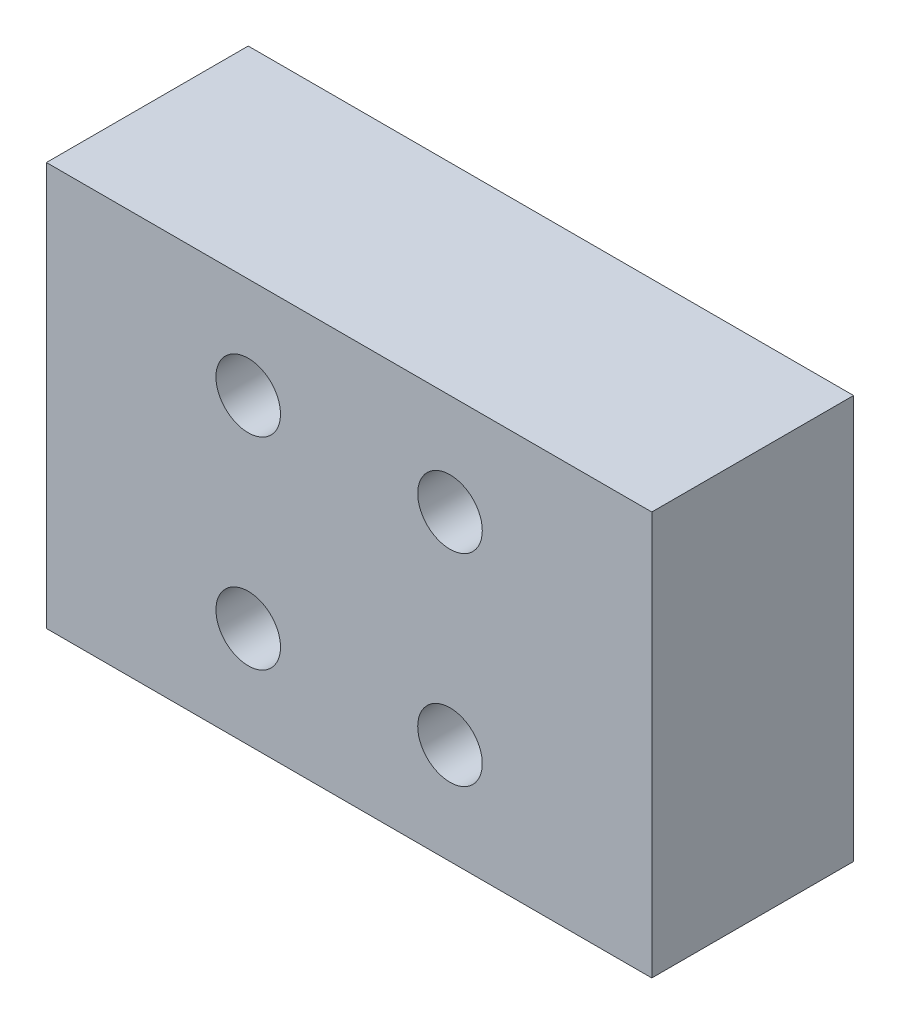
ISO-10303-21;
HEADER;
FILE_DESCRIPTION(('STEP AP214'),'2;1');
FILE_NAME('part.step','',(''),(''),'','','');
FILE_SCHEMA(('AUTOMOTIVE_DESIGN { 1 0 10303 214 1 1 1 1 }'));
ENDSEC;
DATA;
#1=APPLICATION_CONTEXT('core data for automotive mechanical design processes');
#2=APPLICATION_PROTOCOL_DEFINITION('international standard','automotive_design',2000,#1);
#3=PRODUCT_CONTEXT('',#1,'mechanical');
#4=PRODUCT('Part','Part','',(#3));
#5=PRODUCT_RELATED_PRODUCT_CATEGORY('part','',(#4));
#6=PRODUCT_DEFINITION_FORMATION('','',#4);
#7=PRODUCT_DEFINITION_CONTEXT('part definition',#1,'design');
#8=PRODUCT_DEFINITION('design','',#6,#7);
#9=PRODUCT_DEFINITION_SHAPE('','',#8);
#10=(LENGTH_UNIT() NAMED_UNIT(*) SI_UNIT(.MILLI.,.METRE.));
#11=(NAMED_UNIT(*) PLANE_ANGLE_UNIT() SI_UNIT($,.RADIAN.));
#12=(NAMED_UNIT(*) SI_UNIT($,.STERADIAN.) SOLID_ANGLE_UNIT());
#13=UNCERTAINTY_MEASURE_WITH_UNIT(LENGTH_MEASURE(1.E-05),#10,'distance_accuracy_value','');
#14=(GEOMETRIC_REPRESENTATION_CONTEXT(3) GLOBAL_UNCERTAINTY_ASSIGNED_CONTEXT((#13)) GLOBAL_UNIT_ASSIGNED_CONTEXT((#10,
#11,#12)) REPRESENTATION_CONTEXT('',''));
#15=CARTESIAN_POINT('',(0.,0.,0.));
#16=DIRECTION('',(0.,0.,1.));
#17=DIRECTION('',(1.,0.,0.));
#18=AXIS2_PLACEMENT_3D('',#15,#16,#17);
#19=CARTESIAN_POINT('',(0.,0.,10.));
#20=DIRECTION('',(1.,0.,0.));
#21=DIRECTION('',(0.,1.,0.));
#22=AXIS2_PLACEMENT_3D('',#19,#20,#21);
#23=PLANE('',#22);
#24=DIRECTION('',(0.,-1.,0.));
#25=VECTOR('',#24,1.);
#26=CARTESIAN_POINT('',(0.,0.,0.));
#27=LINE('',#26,#25);
#28=CARTESIAN_POINT('',(0.,0.,0.));
#29=VERTEX_POINT('',#28);
#30=CARTESIAN_POINT('',(0.,-20.,0.));
#31=VERTEX_POINT('',#30);
#32=EDGE_CURVE('E111',#29,#31,#27,.T.);
#33=ORIENTED_EDGE('',*,*,#32,.T.);
#34=DIRECTION('',(0.,0.,-1.));
#35=VECTOR('',#34,1.);
#36=CARTESIAN_POINT('',(0.,-20.,10.));
#37=LINE('',#36,#35);
#38=CARTESIAN_POINT('',(0.,-20.,10.));
#39=VERTEX_POINT('',#38);
#40=EDGE_CURVE('E11',#39,#31,#37,.T.);
#41=ORIENTED_EDGE('',*,*,#40,.F.);
#42=DIRECTION('',(0.,-1.,0.));
#43=VECTOR('',#42,1.);
#44=CARTESIAN_POINT('',(0.,0.,10.));
#45=LINE('',#44,#43);
#46=CARTESIAN_POINT('',(0.,0.,10.));
#47=VERTEX_POINT('',#46);
#48=EDGE_CURVE('E95',#47,#39,#45,.T.);
#49=ORIENTED_EDGE('',*,*,#48,.F.);
#50=DIRECTION('',(0.,0.,-1.));
#51=VECTOR('',#50,1.);
#52=CARTESIAN_POINT('',(0.,0.,10.));
#53=LINE('',#52,#51);
#54=EDGE_CURVE('E107',#47,#29,#53,.T.);
#55=ORIENTED_EDGE('',*,*,#54,.T.);
#56=EDGE_LOOP('',(#33,#41,#49,#55));
#57=FACE_BOUND('',#56,.T.);
#58=ADVANCED_FACE('F43',(#57),#23,.F.);
#59=CARTESIAN_POINT('',(0.,-20.,10.));
#60=DIRECTION('',(0.,1.,0.));
#61=DIRECTION('',(0.,0.,1.));
#62=AXIS2_PLACEMENT_3D('',#59,#60,#61);
#63=PLANE('',#62);
#64=DIRECTION('',(1.,0.,0.));
#65=VECTOR('',#64,1.);
#66=CARTESIAN_POINT('',(0.,-20.,0.));
#67=LINE('',#66,#65);
#68=CARTESIAN_POINT('',(30.,-20.,0.));
#69=VERTEX_POINT('',#68);
#70=EDGE_CURVE('E100',#31,#69,#67,.T.);
#71=ORIENTED_EDGE('',*,*,#70,.T.);
#72=DIRECTION('',(0.,0.,-1.));
#73=VECTOR('',#72,1.);
#74=CARTESIAN_POINT('',(30.,-20.,10.));
#75=LINE('',#74,#73);
#76=CARTESIAN_POINT('',(30.,-20.,10.));
#77=VERTEX_POINT('',#76);
#78=EDGE_CURVE('E52',#77,#69,#75,.T.);
#79=ORIENTED_EDGE('',*,*,#78,.F.);
#80=DIRECTION('',(1.,0.,0.));
#81=VECTOR('',#80,1.);
#82=CARTESIAN_POINT('',(0.,-20.,10.));
#83=LINE('',#82,#81);
#84=EDGE_CURVE('E90',#39,#77,#83,.T.);
#85=ORIENTED_EDGE('',*,*,#84,.F.);
#86=ORIENTED_EDGE('',*,*,#40,.T.);
#87=EDGE_LOOP('',(#71,#79,#85,#86));
#88=FACE_BOUND('',#87,.T.);
#89=ADVANCED_FACE('F99',(#88),#63,.F.);
#90=CARTESIAN_POINT('',(30.,0.,10.));
#91=DIRECTION('',(-1.,0.,0.));
#92=DIRECTION('',(0.,-1.,0.));
#93=AXIS2_PLACEMENT_3D('',#90,#91,#92);
#94=PLANE('',#93);
#95=DIRECTION('',(0.,1.,0.));
#96=VECTOR('',#95,1.);
#97=CARTESIAN_POINT('',(30.,0.,0.));
#98=LINE('',#97,#96);
#99=CARTESIAN_POINT('',(30.,0.,0.));
#100=VERTEX_POINT('',#99);
#101=EDGE_CURVE('E77',#69,#100,#98,.T.);
#102=ORIENTED_EDGE('',*,*,#101,.T.);
#103=DIRECTION('',(0.,0.,-1.));
#104=VECTOR('',#103,1.);
#105=CARTESIAN_POINT('',(30.,0.,10.));
#106=LINE('',#105,#104);
#107=CARTESIAN_POINT('',(30.,0.,10.));
#108=VERTEX_POINT('',#107);
#109=EDGE_CURVE('E102',#108,#100,#106,.T.);
#110=ORIENTED_EDGE('',*,*,#109,.F.);
#111=DIRECTION('',(0.,1.,0.));
#112=VECTOR('',#111,1.);
#113=CARTESIAN_POINT('',(30.,0.,10.));
#114=LINE('',#113,#112);
#115=EDGE_CURVE('E93',#77,#108,#114,.T.);
#116=ORIENTED_EDGE('',*,*,#115,.F.);
#117=ORIENTED_EDGE('',*,*,#78,.T.);
#118=EDGE_LOOP('',(#102,#110,#116,#117));
#119=FACE_BOUND('',#118,.T.);
#120=ADVANCED_FACE('F103',(#119),#94,.F.);
#121=CARTESIAN_POINT('',(0.,0.,10.));
#122=DIRECTION('',(0.,-1.,0.));
#123=DIRECTION('',(0.,0.,-1.));
#124=AXIS2_PLACEMENT_3D('',#121,#122,#123);
#125=PLANE('',#124);
#126=DIRECTION('',(-1.,0.,0.));
#127=VECTOR('',#126,1.);
#128=CARTESIAN_POINT('',(0.,0.,0.));
#129=LINE('',#128,#127);
#130=EDGE_CURVE('E83',#100,#29,#129,.T.);
#131=ORIENTED_EDGE('',*,*,#130,.T.);
#132=ORIENTED_EDGE('',*,*,#54,.F.);
#133=DIRECTION('',(-1.,0.,0.));
#134=VECTOR('',#133,1.);
#135=CARTESIAN_POINT('',(0.,0.,10.));
#136=LINE('',#135,#134);
#137=EDGE_CURVE('E60',#108,#47,#136,.T.);
#138=ORIENTED_EDGE('',*,*,#137,.F.);
#139=ORIENTED_EDGE('',*,*,#109,.T.);
#140=EDGE_LOOP('',(#131,#132,#138,#139));
#141=FACE_BOUND('',#140,.T.);
#142=ADVANCED_FACE('F125',(#141),#125,.F.);
#143=CARTESIAN_POINT('',(0.,0.,10.));
#144=DIRECTION('',(0.,0.,1.));
#145=DIRECTION('',(1.,0.,0.));
#146=AXIS2_PLACEMENT_3D('',#143,#144,#145);
#147=PLANE('',#146);
#148=CARTESIAN_POINT('',(20.,-5.,10.));
#149=DIRECTION('',(0.,0.,1.));
#150=DIRECTION('',(1.,0.,0.));
#151=AXIS2_PLACEMENT_3D('',#148,#149,#150);
#152=CIRCLE('',#151,1.6);
#153=CARTESIAN_POINT('',(21.6,-5.,10.));
#154=VERTEX_POINT('',#153);
#155=EDGE_CURVE('E144',#154,#154,#152,.T.);
#156=ORIENTED_EDGE('',*,*,#155,.F.);
#157=EDGE_LOOP('',(#156));
#158=FACE_BOUND('',#157,.T.);
#159=CARTESIAN_POINT('',(20.,-15.,10.));
#160=DIRECTION('',(0.,0.,1.));
#161=DIRECTION('',(-1.,0.,0.));
#162=AXIS2_PLACEMENT_3D('',#159,#160,#161);
#163=CIRCLE('',#162,1.6);
#164=CARTESIAN_POINT('',(18.4,-15.,10.));
#165=VERTEX_POINT('',#164);
#166=EDGE_CURVE('E152',#165,#165,#163,.T.);
#167=ORIENTED_EDGE('',*,*,#166,.F.);
#168=EDGE_LOOP('',(#167));
#169=FACE_BOUND('',#168,.T.);
#170=CARTESIAN_POINT('',(10.,-15.,10.));
#171=DIRECTION('',(0.,0.,1.));
#172=DIRECTION('',(1.,0.,0.));
#173=AXIS2_PLACEMENT_3D('',#170,#171,#172);
#174=CIRCLE('',#173,1.6);
#175=CARTESIAN_POINT('',(11.6,-15.,10.));
#176=VERTEX_POINT('',#175);
#177=EDGE_CURVE('E136',#176,#176,#174,.T.);
#178=ORIENTED_EDGE('',*,*,#177,.F.);
#179=EDGE_LOOP('',(#178));
#180=FACE_BOUND('',#179,.T.);
#181=CARTESIAN_POINT('',(10.,-5.,10.));
#182=DIRECTION('',(0.,0.,1.));
#183=DIRECTION('',(-1.,0.,0.));
#184=AXIS2_PLACEMENT_3D('',#181,#182,#183);
#185=CIRCLE('',#184,1.6);
#186=CARTESIAN_POINT('',(8.4,-5.,10.));
#187=VERTEX_POINT('',#186);
#188=EDGE_CURVE('E132',#187,#187,#185,.T.);
#189=ORIENTED_EDGE('',*,*,#188,.F.);
#190=EDGE_LOOP('',(#189));
#191=FACE_BOUND('',#190,.T.);
#192=ORIENTED_EDGE('',*,*,#48,.T.);
#193=ORIENTED_EDGE('',*,*,#84,.T.);
#194=ORIENTED_EDGE('',*,*,#115,.T.);
#195=ORIENTED_EDGE('',*,*,#137,.T.);
#196=EDGE_LOOP('',(#192,#193,#194,#195));
#197=FACE_BOUND('',#196,.T.);
#198=ADVANCED_FACE('F91',(#158,#169,#180,#191,#197),#147,.T.);
#199=CARTESIAN_POINT('',(0.,0.,0.));
#200=DIRECTION('',(0.,0.,1.));
#201=DIRECTION('',(1.,0.,0.));
#202=AXIS2_PLACEMENT_3D('',#199,#200,#201);
#203=PLANE('',#202);
#204=CARTESIAN_POINT('',(20.,-5.,0.));
#205=DIRECTION('',(0.,0.,1.));
#206=DIRECTION('',(1.,0.,0.));
#207=AXIS2_PLACEMENT_3D('',#204,#205,#206);
#208=CIRCLE('',#207,1.6);
#209=CARTESIAN_POINT('',(21.6,-5.,0.));
#210=VERTEX_POINT('',#209);
#211=EDGE_CURVE('E140',#210,#210,#208,.T.);
#212=ORIENTED_EDGE('',*,*,#211,.T.);
#213=EDGE_LOOP('',(#212));
#214=FACE_BOUND('',#213,.T.);
#215=CARTESIAN_POINT('',(20.,-15.,0.));
#216=DIRECTION('',(0.,0.,1.));
#217=DIRECTION('',(-1.,0.,0.));
#218=AXIS2_PLACEMENT_3D('',#215,#216,#217);
#219=CIRCLE('',#218,1.6);
#220=CARTESIAN_POINT('',(18.4,-15.,0.));
#221=VERTEX_POINT('',#220);
#222=EDGE_CURVE('E148',#221,#221,#219,.T.);
#223=ORIENTED_EDGE('',*,*,#222,.T.);
#224=EDGE_LOOP('',(#223));
#225=FACE_BOUND('',#224,.T.);
#226=CARTESIAN_POINT('',(10.,-15.,0.));
#227=DIRECTION('',(0.,0.,1.));
#228=DIRECTION('',(1.,0.,0.));
#229=AXIS2_PLACEMENT_3D('',#226,#227,#228);
#230=CIRCLE('',#229,1.6);
#231=CARTESIAN_POINT('',(11.6,-15.,0.));
#232=VERTEX_POINT('',#231);
#233=EDGE_CURVE('E156',#232,#232,#230,.T.);
#234=ORIENTED_EDGE('',*,*,#233,.T.);
#235=EDGE_LOOP('',(#234));
#236=FACE_BOUND('',#235,.T.);
#237=CARTESIAN_POINT('',(10.,-5.,0.));
#238=DIRECTION('',(0.,0.,1.));
#239=DIRECTION('',(-1.,0.,0.));
#240=AXIS2_PLACEMENT_3D('',#237,#238,#239);
#241=CIRCLE('',#240,1.6);
#242=CARTESIAN_POINT('',(8.4,-5.,0.));
#243=VERTEX_POINT('',#242);
#244=EDGE_CURVE('E115',#243,#243,#241,.T.);
#245=ORIENTED_EDGE('',*,*,#244,.T.);
#246=EDGE_LOOP('',(#245));
#247=FACE_BOUND('',#246,.T.);
#248=ORIENTED_EDGE('',*,*,#32,.F.);
#249=ORIENTED_EDGE('',*,*,#130,.F.);
#250=ORIENTED_EDGE('',*,*,#101,.F.);
#251=ORIENTED_EDGE('',*,*,#70,.F.);
#252=EDGE_LOOP('',(#248,#249,#250,#251));
#253=FACE_BOUND('',#252,.T.);
#254=ADVANCED_FACE('F128',(#214,#225,#236,#247,#253),#203,.F.);
#255=CARTESIAN_POINT('',(10.,-5.,0.));
#256=DIRECTION('',(0.,0.,1.));
#257=DIRECTION('',(1.,0.,0.));
#258=AXIS2_PLACEMENT_3D('',#255,#256,#257);
#259=CYLINDRICAL_SURFACE('',#258,1.6);
#260=ORIENTED_EDGE('',*,*,#244,.F.);
#261=EDGE_LOOP('',(#260));
#262=FACE_BOUND('',#261,.T.);
#263=ORIENTED_EDGE('',*,*,#188,.T.);
#264=EDGE_LOOP('',(#263));
#265=FACE_BOUND('',#264,.T.);
#266=ADVANCED_FACE('F172',(#262,#265),#259,.F.);
#267=CARTESIAN_POINT('',(10.,-15.,0.));
#268=DIRECTION('',(0.,0.,1.));
#269=DIRECTION('',(1.,0.,0.));
#270=AXIS2_PLACEMENT_3D('',#267,#268,#269);
#271=CYLINDRICAL_SURFACE('',#270,1.6);
#272=ORIENTED_EDGE('',*,*,#233,.F.);
#273=EDGE_LOOP('',(#272));
#274=FACE_BOUND('',#273,.T.);
#275=ORIENTED_EDGE('',*,*,#177,.T.);
#276=EDGE_LOOP('',(#275));
#277=FACE_BOUND('',#276,.T.);
#278=ADVANCED_FACE('F164',(#274,#277),#271,.F.);
#279=CARTESIAN_POINT('',(20.,-15.,0.));
#280=DIRECTION('',(0.,0.,1.));
#281=DIRECTION('',(1.,0.,0.));
#282=AXIS2_PLACEMENT_3D('',#279,#280,#281);
#283=CYLINDRICAL_SURFACE('',#282,1.6);
#284=ORIENTED_EDGE('',*,*,#222,.F.);
#285=EDGE_LOOP('',(#284));
#286=FACE_BOUND('',#285,.T.);
#287=ORIENTED_EDGE('',*,*,#166,.T.);
#288=EDGE_LOOP('',(#287));
#289=FACE_BOUND('',#288,.T.);
#290=ADVANCED_FACE('F180',(#286,#289),#283,.F.);
#291=CARTESIAN_POINT('',(20.,-5.,0.));
#292=DIRECTION('',(0.,0.,1.));
#293=DIRECTION('',(1.,0.,0.));
#294=AXIS2_PLACEMENT_3D('',#291,#292,#293);
#295=CYLINDRICAL_SURFACE('',#294,1.6);
#296=ORIENTED_EDGE('',*,*,#211,.F.);
#297=EDGE_LOOP('',(#296));
#298=FACE_BOUND('',#297,.T.);
#299=ORIENTED_EDGE('',*,*,#155,.T.);
#300=EDGE_LOOP('',(#299));
#301=FACE_BOUND('',#300,.T.);
#302=ADVANCED_FACE('F231',(#298,#301),#295,.F.);
#303=CLOSED_SHELL('',(#58,#89,#120,#142,#198,#254,#266,#278,#290,#302));
#304=MANIFOLD_SOLID_BREP('B2',#303);
#305=ADVANCED_BREP_SHAPE_REPRESENTATION('',(#18,#304),#14);
#306=SHAPE_DEFINITION_REPRESENTATION(#9,#305);
ENDSEC;
END-ISO-10303-21;
